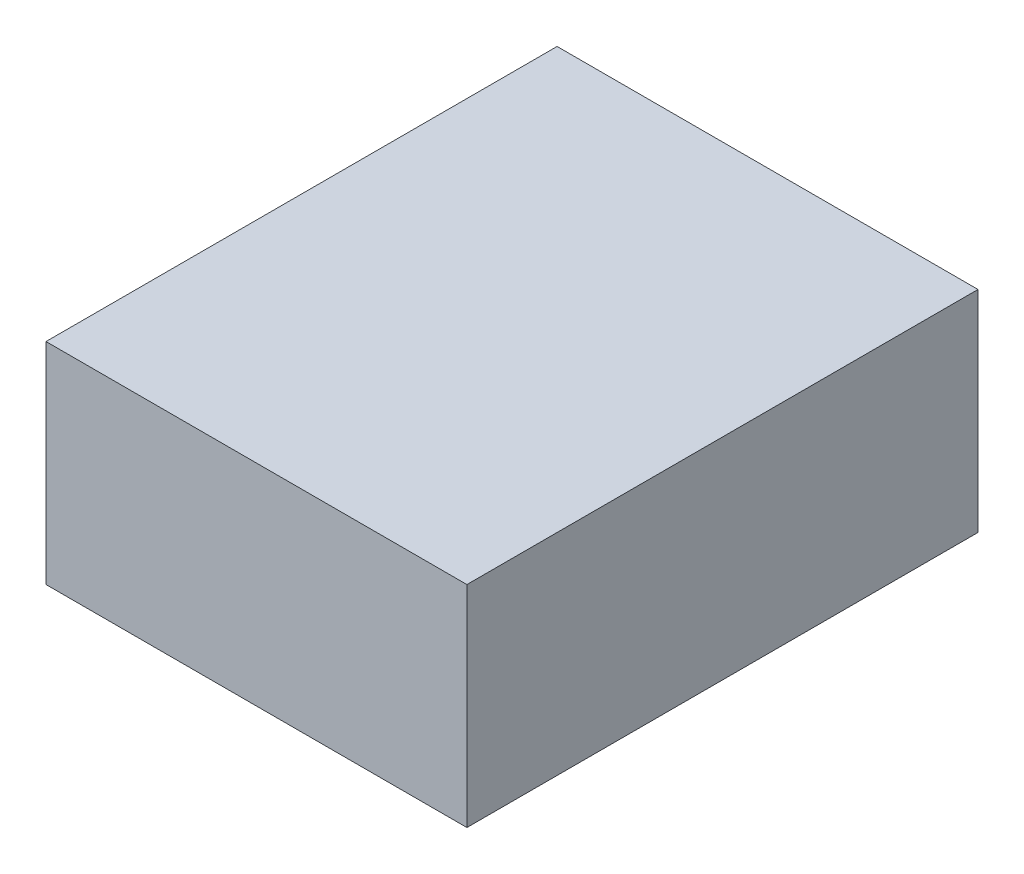
ISO-10303-21;
HEADER;
FILE_DESCRIPTION(('STEP AP214'),'2;1');
FILE_NAME('part.step','',(''),(''),'','','');
FILE_SCHEMA(('AUTOMOTIVE_DESIGN { 1 0 10303 214 1 1 1 1 }'));
ENDSEC;
DATA;
#1=APPLICATION_CONTEXT('core data for automotive mechanical design processes');
#2=APPLICATION_PROTOCOL_DEFINITION('international standard','automotive_design',2000,#1);
#3=PRODUCT_CONTEXT('',#1,'mechanical');
#4=PRODUCT('Part','Part','',(#3));
#5=PRODUCT_RELATED_PRODUCT_CATEGORY('part','',(#4));
#6=PRODUCT_DEFINITION_FORMATION('','',#4);
#7=PRODUCT_DEFINITION_CONTEXT('part definition',#1,'design');
#8=PRODUCT_DEFINITION('design','',#6,#7);
#9=PRODUCT_DEFINITION_SHAPE('','',#8);
#10=(LENGTH_UNIT() NAMED_UNIT(*) SI_UNIT(.MILLI.,.METRE.));
#11=(NAMED_UNIT(*) PLANE_ANGLE_UNIT() SI_UNIT($,.RADIAN.));
#12=(NAMED_UNIT(*) SI_UNIT($,.STERADIAN.) SOLID_ANGLE_UNIT());
#13=UNCERTAINTY_MEASURE_WITH_UNIT(LENGTH_MEASURE(1.E-05),#10,'distance_accuracy_value','');
#14=(GEOMETRIC_REPRESENTATION_CONTEXT(3) GLOBAL_UNCERTAINTY_ASSIGNED_CONTEXT((#13)) GLOBAL_UNIT_ASSIGNED_CONTEXT((#10,
#11,#12)) REPRESENTATION_CONTEXT('',''));
#15=CARTESIAN_POINT('',(0.,0.,0.));
#16=DIRECTION('',(0.,0.,1.));
#17=DIRECTION('',(1.,0.,0.));
#18=AXIS2_PLACEMENT_3D('',#15,#16,#17);
#19=CARTESIAN_POINT('',(177.8,177.8,-215.9));
#20=DIRECTION('',(-1.,0.,0.));
#21=DIRECTION('',(0.,0.,1.));
#22=AXIS2_PLACEMENT_3D('',#19,#20,#21);
#23=PLANE('',#22);
#24=DIRECTION('',(0.,0.,-1.));
#25=VECTOR('',#24,1.);
#26=CARTESIAN_POINT('',(177.8,0.,-215.9));
#27=LINE('',#26,#25);
#28=CARTESIAN_POINT('',(177.8,0.,215.9));
#29=VERTEX_POINT('',#28);
#30=CARTESIAN_POINT('',(177.8,0.,-215.9));
#31=VERTEX_POINT('',#30);
#32=EDGE_CURVE('E103',#29,#31,#27,.T.);
#33=ORIENTED_EDGE('',*,*,#32,.T.);
#34=DIRECTION('',(0.,-1.,0.));
#35=VECTOR('',#34,1.);
#36=CARTESIAN_POINT('',(177.8,177.8,-215.9));
#37=LINE('',#36,#35);
#38=CARTESIAN_POINT('',(177.8,177.8,-215.9));
#39=VERTEX_POINT('',#38);
#40=EDGE_CURVE('E11',#39,#31,#37,.T.);
#41=ORIENTED_EDGE('',*,*,#40,.F.);
#42=DIRECTION('',(0.,0.,-1.));
#43=VECTOR('',#42,1.);
#44=CARTESIAN_POINT('',(177.8,177.8,-215.9));
#45=LINE('',#44,#43);
#46=CARTESIAN_POINT('',(177.8,177.8,215.9));
#47=VERTEX_POINT('',#46);
#48=EDGE_CURVE('E91',#47,#39,#45,.T.);
#49=ORIENTED_EDGE('',*,*,#48,.F.);
#50=DIRECTION('',(0.,-1.,0.));
#51=VECTOR('',#50,1.);
#52=CARTESIAN_POINT('',(177.8,177.8,215.9));
#53=LINE('',#52,#51);
#54=EDGE_CURVE('E99',#47,#29,#53,.T.);
#55=ORIENTED_EDGE('',*,*,#54,.T.);
#56=EDGE_LOOP('',(#33,#41,#49,#55));
#57=FACE_BOUND('',#56,.T.);
#58=ADVANCED_FACE('F40',(#57),#23,.F.);
#59=CARTESIAN_POINT('',(-177.8,177.8,-215.9));
#60=DIRECTION('',(0.,0.,1.));
#61=DIRECTION('',(1.,0.,0.));
#62=AXIS2_PLACEMENT_3D('',#59,#60,#61);
#63=PLANE('',#62);
#64=DIRECTION('',(-1.,0.,0.));
#65=VECTOR('',#64,1.);
#66=CARTESIAN_POINT('',(-177.8,0.,-215.9));
#67=LINE('',#66,#65);
#68=CARTESIAN_POINT('',(-177.8,0.,-215.9));
#69=VERTEX_POINT('',#68);
#70=EDGE_CURVE('E95',#31,#69,#67,.T.);
#71=ORIENTED_EDGE('',*,*,#70,.T.);
#72=DIRECTION('',(0.,-1.,0.));
#73=VECTOR('',#72,1.);
#74=CARTESIAN_POINT('',(-177.8,177.8,-215.9));
#75=LINE('',#74,#73);
#76=CARTESIAN_POINT('',(-177.8,177.8,-215.9));
#77=VERTEX_POINT('',#76);
#78=EDGE_CURVE('E48',#77,#69,#75,.T.);
#79=ORIENTED_EDGE('',*,*,#78,.F.);
#80=DIRECTION('',(-1.,0.,0.));
#81=VECTOR('',#80,1.);
#82=CARTESIAN_POINT('',(-177.8,177.8,-215.9));
#83=LINE('',#82,#81);
#84=EDGE_CURVE('E86',#39,#77,#83,.T.);
#85=ORIENTED_EDGE('',*,*,#84,.F.);
#86=ORIENTED_EDGE('',*,*,#40,.T.);
#87=EDGE_LOOP('',(#71,#79,#85,#86));
#88=FACE_BOUND('',#87,.T.);
#89=ADVANCED_FACE('F94',(#88),#63,.F.);
#90=CARTESIAN_POINT('',(-177.8,177.8,-215.9));
#91=DIRECTION('',(1.,0.,0.));
#92=DIRECTION('',(0.,0.,-1.));
#93=AXIS2_PLACEMENT_3D('',#90,#91,#92);
#94=PLANE('',#93);
#95=DIRECTION('',(0.,0.,1.));
#96=VECTOR('',#95,1.);
#97=CARTESIAN_POINT('',(-177.8,0.,-215.9));
#98=LINE('',#97,#96);
#99=CARTESIAN_POINT('',(-177.8,0.,215.9));
#100=VERTEX_POINT('',#99);
#101=EDGE_CURVE('E73',#69,#100,#98,.T.);
#102=ORIENTED_EDGE('',*,*,#101,.T.);
#103=DIRECTION('',(0.,-1.,0.));
#104=VECTOR('',#103,1.);
#105=CARTESIAN_POINT('',(-177.8,177.8,215.9));
#106=LINE('',#105,#104);
#107=CARTESIAN_POINT('',(-177.8,177.8,215.9));
#108=VERTEX_POINT('',#107);
#109=EDGE_CURVE('E96',#108,#100,#106,.T.);
#110=ORIENTED_EDGE('',*,*,#109,.F.);
#111=DIRECTION('',(0.,0.,1.));
#112=VECTOR('',#111,1.);
#113=CARTESIAN_POINT('',(-177.8,177.8,-215.9));
#114=LINE('',#113,#112);
#115=EDGE_CURVE('E89',#77,#108,#114,.T.);
#116=ORIENTED_EDGE('',*,*,#115,.F.);
#117=ORIENTED_EDGE('',*,*,#78,.T.);
#118=EDGE_LOOP('',(#102,#110,#116,#117));
#119=FACE_BOUND('',#118,.T.);
#120=ADVANCED_FACE('F97',(#119),#94,.F.);
#121=CARTESIAN_POINT('',(-177.8,177.8,215.9));
#122=DIRECTION('',(0.,0.,-1.));
#123=DIRECTION('',(-1.,0.,0.));
#124=AXIS2_PLACEMENT_3D('',#121,#122,#123);
#125=PLANE('',#124);
#126=DIRECTION('',(1.,0.,0.));
#127=VECTOR('',#126,1.);
#128=CARTESIAN_POINT('',(-177.8,0.,215.9));
#129=LINE('',#128,#127);
#130=EDGE_CURVE('E79',#100,#29,#129,.T.);
#131=ORIENTED_EDGE('',*,*,#130,.T.);
#132=ORIENTED_EDGE('',*,*,#54,.F.);
#133=DIRECTION('',(1.,0.,0.));
#134=VECTOR('',#133,1.);
#135=CARTESIAN_POINT('',(-177.8,177.8,215.9));
#136=LINE('',#135,#134);
#137=EDGE_CURVE('E56',#108,#47,#136,.T.);
#138=ORIENTED_EDGE('',*,*,#137,.F.);
#139=ORIENTED_EDGE('',*,*,#109,.T.);
#140=EDGE_LOOP('',(#131,#132,#138,#139));
#141=FACE_BOUND('',#140,.T.);
#142=ADVANCED_FACE('F110',(#141),#125,.F.);
#143=CARTESIAN_POINT('',(0.,177.8,0.));
#144=DIRECTION('',(0.,1.,0.));
#145=DIRECTION('',(0.,0.,1.));
#146=AXIS2_PLACEMENT_3D('',#143,#144,#145);
#147=PLANE('',#146);
#148=ORIENTED_EDGE('',*,*,#48,.T.);
#149=ORIENTED_EDGE('',*,*,#84,.T.);
#150=ORIENTED_EDGE('',*,*,#115,.T.);
#151=ORIENTED_EDGE('',*,*,#137,.T.);
#152=EDGE_LOOP('',(#148,#149,#150,#151));
#153=FACE_BOUND('',#152,.T.);
#154=ADVANCED_FACE('F87',(#153),#147,.T.);
#155=CARTESIAN_POINT('',(0.,0.,0.));
#156=DIRECTION('',(0.,1.,0.));
#157=DIRECTION('',(0.,0.,1.));
#158=AXIS2_PLACEMENT_3D('',#155,#156,#157);
#159=PLANE('',#158);
#160=ORIENTED_EDGE('',*,*,#32,.F.);
#161=ORIENTED_EDGE('',*,*,#130,.F.);
#162=ORIENTED_EDGE('',*,*,#101,.F.);
#163=ORIENTED_EDGE('',*,*,#70,.F.);
#164=EDGE_LOOP('',(#160,#161,#162,#163));
#165=FACE_BOUND('',#164,.T.);
#166=ADVANCED_FACE('F113',(#165),#159,.F.);
#167=CLOSED_SHELL('',(#58,#89,#120,#142,#154,#166));
#168=MANIFOLD_SOLID_BREP('B2',#167);
#169=ADVANCED_BREP_SHAPE_REPRESENTATION('',(#18,#168),#14);
#170=SHAPE_DEFINITION_REPRESENTATION(#9,#169);
ENDSEC;
END-ISO-10303-21;
